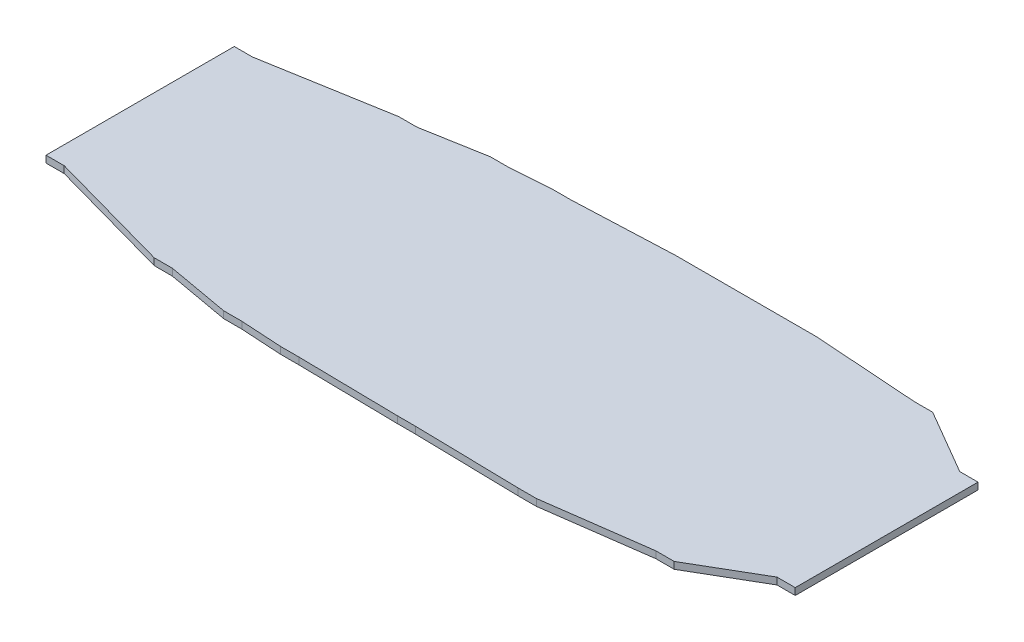
ISO-10303-21;
HEADER;
FILE_DESCRIPTION(('STEP AP214'),'2;1');
FILE_NAME('part.step','',(''),(''),'','','');
FILE_SCHEMA(('AUTOMOTIVE_DESIGN { 1 0 10303 214 1 1 1 1 }'));
ENDSEC;
DATA;
#1=APPLICATION_CONTEXT('core data for automotive mechanical design processes');
#2=APPLICATION_PROTOCOL_DEFINITION('international standard','automotive_design',2000,#1);
#3=PRODUCT_CONTEXT('',#1,'mechanical');
#4=PRODUCT('Part','Part','',(#3));
#5=PRODUCT_RELATED_PRODUCT_CATEGORY('part','',(#4));
#6=PRODUCT_DEFINITION_FORMATION('','',#4);
#7=PRODUCT_DEFINITION_CONTEXT('part definition',#1,'design');
#8=PRODUCT_DEFINITION('design','',#6,#7);
#9=PRODUCT_DEFINITION_SHAPE('','',#8);
#10=(LENGTH_UNIT() NAMED_UNIT(*) SI_UNIT(.MILLI.,.METRE.));
#11=(NAMED_UNIT(*) PLANE_ANGLE_UNIT() SI_UNIT($,.RADIAN.));
#12=(NAMED_UNIT(*) SI_UNIT($,.STERADIAN.) SOLID_ANGLE_UNIT());
#13=UNCERTAINTY_MEASURE_WITH_UNIT(LENGTH_MEASURE(1.E-05),#10,'distance_accuracy_value','');
#14=(GEOMETRIC_REPRESENTATION_CONTEXT(3) GLOBAL_UNCERTAINTY_ASSIGNED_CONTEXT((#13)) GLOBAL_UNIT_ASSIGNED_CONTEXT((#10,
#11,#12)) REPRESENTATION_CONTEXT('',''));
#15=CARTESIAN_POINT('',(0.,0.,0.));
#16=DIRECTION('',(0.,0.,1.));
#17=DIRECTION('',(1.,0.,0.));
#18=AXIS2_PLACEMENT_3D('',#15,#16,#17);
#19=CARTESIAN_POINT('',(-156.250453446982,3.,-43.9920991433387));
#20=DIRECTION('',(0.,0.,1.));
#21=DIRECTION('',(1.,0.,0.));
#22=AXIS2_PLACEMENT_3D('',#19,#20,#21);
#23=PLANE('',#22);
#24=DIRECTION('',(-1.,0.,0.));
#25=VECTOR('',#24,1.);
#26=CARTESIAN_POINT('',(-156.250453446982,0.,-43.9920991433387));
#27=LINE('',#26,#25);
#28=CARTESIAN_POINT('',(-156.250453446982,0.,-43.9920991433387));
#29=VERTEX_POINT('',#28);
#30=CARTESIAN_POINT('',(-164.250453446982,0.,-43.9920991433387));
#31=VERTEX_POINT('',#30);
#32=EDGE_CURVE('E279',#29,#31,#27,.T.);
#33=ORIENTED_EDGE('',*,*,#32,.T.);
#34=DIRECTION('',(0.,-1.,0.));
#35=VECTOR('',#34,1.);
#36=CARTESIAN_POINT('',(-164.250453446982,3.,-43.9920991433387));
#37=LINE('',#36,#35);
#38=CARTESIAN_POINT('',(-164.250453446982,3.,-43.9920991433387));
#39=VERTEX_POINT('',#38);
#40=EDGE_CURVE('E11',#39,#31,#37,.T.);
#41=ORIENTED_EDGE('',*,*,#40,.F.);
#42=DIRECTION('',(-1.,0.,0.));
#43=VECTOR('',#42,1.);
#44=CARTESIAN_POINT('',(-156.250453446982,3.,-43.9920991433387));
#45=LINE('',#44,#43);
#46=CARTESIAN_POINT('',(-156.250453446982,3.,-43.9920991433387));
#47=VERTEX_POINT('',#46);
#48=EDGE_CURVE('E341',#47,#39,#45,.T.);
#49=ORIENTED_EDGE('',*,*,#48,.F.);
#50=DIRECTION('',(0.,-1.,0.));
#51=VECTOR('',#50,1.);
#52=CARTESIAN_POINT('',(-156.250453446982,3.,-43.9920991433387));
#53=LINE('',#52,#51);
#54=EDGE_CURVE('E275',#47,#29,#53,.T.);
#55=ORIENTED_EDGE('',*,*,#54,.T.);
#56=EDGE_LOOP('',(#33,#41,#49,#55));
#57=FACE_BOUND('',#56,.T.);
#58=ADVANCED_FACE('F39',(#57),#23,.F.);
#59=CARTESIAN_POINT('',(-164.250453446982,3.,-43.9920991433387));
#60=DIRECTION('',(1.,0.,0.));
#61=DIRECTION('',(0.,0.,-1.));
#62=AXIS2_PLACEMENT_3D('',#59,#60,#61);
#63=PLANE('',#62);
#64=DIRECTION('',(0.,0.,1.));
#65=VECTOR('',#64,1.);
#66=CARTESIAN_POINT('',(-164.250453446982,0.,-43.9920991433387));
#67=LINE('',#66,#65);
#68=CARTESIAN_POINT('',(-164.250453446982,0.,38.5752174136704));
#69=VERTEX_POINT('',#68);
#70=EDGE_CURVE('E282',#31,#69,#67,.T.);
#71=ORIENTED_EDGE('',*,*,#70,.T.);
#72=DIRECTION('',(0.,-1.,0.));
#73=VECTOR('',#72,1.);
#74=CARTESIAN_POINT('',(-164.250453446982,3.,38.5752174136704));
#75=LINE('',#74,#73);
#76=CARTESIAN_POINT('',(-164.250453446982,3.,38.5752174136704));
#77=VERTEX_POINT('',#76);
#78=EDGE_CURVE('E47',#77,#69,#75,.T.);
#79=ORIENTED_EDGE('',*,*,#78,.F.);
#80=DIRECTION('',(0.,0.,1.));
#81=VECTOR('',#80,1.);
#82=CARTESIAN_POINT('',(-164.250453446982,3.,-43.9920991433387));
#83=LINE('',#82,#81);
#84=EDGE_CURVE('E170',#39,#77,#83,.T.);
#85=ORIENTED_EDGE('',*,*,#84,.F.);
#86=ORIENTED_EDGE('',*,*,#40,.T.);
#87=EDGE_LOOP('',(#71,#79,#85,#86));
#88=FACE_BOUND('',#87,.T.);
#89=ADVANCED_FACE('F519',(#88),#63,.F.);
#90=CARTESIAN_POINT('',(-164.250453446982,3.,38.5752174136704));
#91=DIRECTION('',(0.,0.,-1.));
#92=DIRECTION('',(-1.,0.,0.));
#93=AXIS2_PLACEMENT_3D('',#90,#91,#92);
#94=PLANE('',#93);
#95=DIRECTION('',(1.,0.,0.));
#96=VECTOR('',#95,1.);
#97=CARTESIAN_POINT('',(-164.250453446982,0.,38.5752174136704));
#98=LINE('',#97,#96);
#99=CARTESIAN_POINT('',(-156.250453446982,0.,38.5752174136704));
#100=VERTEX_POINT('',#99);
#101=EDGE_CURVE('E284',#69,#100,#98,.T.);
#102=ORIENTED_EDGE('',*,*,#101,.T.);
#103=DIRECTION('',(0.,-1.,0.));
#104=VECTOR('',#103,1.);
#105=CARTESIAN_POINT('',(-156.250453446982,3.,38.5752174136704));
#106=LINE('',#105,#104);
#107=CARTESIAN_POINT('',(-156.250453446982,3.,38.5752174136704));
#108=VERTEX_POINT('',#107);
#109=EDGE_CURVE('E420',#108,#100,#106,.T.);
#110=ORIENTED_EDGE('',*,*,#109,.F.);
#111=DIRECTION('',(1.,0.,0.));
#112=VECTOR('',#111,1.);
#113=CARTESIAN_POINT('',(-164.250453446982,3.,38.5752174136704));
#114=LINE('',#113,#112);
#115=EDGE_CURVE('E428',#77,#108,#114,.T.);
#116=ORIENTED_EDGE('',*,*,#115,.F.);
#117=ORIENTED_EDGE('',*,*,#78,.T.);
#118=EDGE_LOOP('',(#102,#110,#116,#117));
#119=FACE_BOUND('',#118,.T.);
#120=ADVANCED_FACE('F426',(#119),#94,.F.);
#121=CARTESIAN_POINT('',(-156.250453446982,3.,38.5752174136704));
#122=DIRECTION('',(0.268309351013595,0.,-0.963332804465136));
#123=DIRECTION('',(-0.963332804465136,0.,-0.268309351013595));
#124=AXIS2_PLACEMENT_3D('',#121,#122,#123);
#125=PLANE('',#124);
#126=DIRECTION('',(0.963332804465136,0.,0.268309351013595));
#127=VECTOR('',#126,1.);
#128=CARTESIAN_POINT('',(-156.250453446982,0.,38.5752174136704));
#129=LINE('',#128,#127);
#130=CARTESIAN_POINT('',(-101.593567098596,0.,53.7983611046002));
#131=VERTEX_POINT('',#130);
#132=EDGE_CURVE('E286',#100,#131,#129,.T.);
#133=ORIENTED_EDGE('',*,*,#132,.T.);
#134=DIRECTION('',(0.,-1.,0.));
#135=VECTOR('',#134,1.);
#136=CARTESIAN_POINT('',(-101.593567098596,3.,53.7983611046002));
#137=LINE('',#136,#135);
#138=CARTESIAN_POINT('',(-101.593567098596,3.,53.7983611046002));
#139=VERTEX_POINT('',#138);
#140=EDGE_CURVE('E417',#139,#131,#137,.T.);
#141=ORIENTED_EDGE('',*,*,#140,.F.);
#142=DIRECTION('',(0.963332804465136,0.,0.268309351013595));
#143=VECTOR('',#142,1.);
#144=CARTESIAN_POINT('',(-156.250453446982,3.,38.5752174136704));
#145=LINE('',#144,#143);
#146=EDGE_CURVE('E446',#108,#139,#145,.T.);
#147=ORIENTED_EDGE('',*,*,#146,.F.);
#148=ORIENTED_EDGE('',*,*,#109,.T.);
#149=EDGE_LOOP('',(#133,#141,#147,#148));
#150=FACE_BOUND('',#149,.T.);
#151=ADVANCED_FACE('F437',(#150),#125,.F.);
#152=CARTESIAN_POINT('',(-101.593567098596,3.,53.7983611046002));
#153=DIRECTION('',(0.,0.,-1.));
#154=DIRECTION('',(-1.,0.,0.));
#155=AXIS2_PLACEMENT_3D('',#152,#153,#154);
#156=PLANE('',#155);
#157=DIRECTION('',(1.,0.,0.));
#158=VECTOR('',#157,1.);
#159=CARTESIAN_POINT('',(-101.593567098596,0.,53.7983611046002));
#160=LINE('',#159,#158);
#161=CARTESIAN_POINT('',(-93.5935670985964,0.,53.7983611046002));
#162=VERTEX_POINT('',#161);
#163=EDGE_CURVE('E288',#131,#162,#160,.T.);
#164=ORIENTED_EDGE('',*,*,#163,.T.);
#165=DIRECTION('',(0.,-1.,0.));
#166=VECTOR('',#165,1.);
#167=CARTESIAN_POINT('',(-93.5935670985964,3.,53.7983611046002));
#168=LINE('',#167,#166);
#169=CARTESIAN_POINT('',(-93.5935670985964,3.,53.7983611046002));
#170=VERTEX_POINT('',#169);
#171=EDGE_CURVE('E414',#170,#162,#168,.T.);
#172=ORIENTED_EDGE('',*,*,#171,.F.);
#173=DIRECTION('',(1.,0.,0.));
#174=VECTOR('',#173,1.);
#175=CARTESIAN_POINT('',(-101.593567098596,3.,53.7983611046002));
#176=LINE('',#175,#174);
#177=EDGE_CURVE('E443',#139,#170,#176,.T.);
#178=ORIENTED_EDGE('',*,*,#177,.F.);
#179=ORIENTED_EDGE('',*,*,#140,.T.);
#180=EDGE_LOOP('',(#164,#172,#178,#179));
#181=FACE_BOUND('',#180,.T.);
#182=ADVANCED_FACE('F441',(#181),#156,.F.);
#183=CARTESIAN_POINT('',(-93.5935670985964,3.,53.7983611046002));
#184=DIRECTION('',(0.176143830037052,0.,-0.984364440204886));
#185=DIRECTION('',(-0.984364440204886,0.,-0.176143830037052));
#186=AXIS2_PLACEMENT_3D('',#183,#184,#185);
#187=PLANE('',#186);
#188=DIRECTION('',(0.984364440204886,0.,0.176143830037052));
#189=VECTOR('',#188,1.);
#190=CARTESIAN_POINT('',(-93.5935670985964,0.,53.7983611046002));
#191=LINE('',#190,#189);
#192=CARTESIAN_POINT('',(-66.2085244082977,0.,58.6986867443535));
#193=VERTEX_POINT('',#192);
#194=EDGE_CURVE('E290',#162,#193,#191,.T.);
#195=ORIENTED_EDGE('',*,*,#194,.T.);
#196=DIRECTION('',(0.,-1.,0.));
#197=VECTOR('',#196,1.);
#198=CARTESIAN_POINT('',(-66.2085244082977,3.,58.6986867443535));
#199=LINE('',#198,#197);
#200=CARTESIAN_POINT('',(-66.2085244082977,3.,58.6986867443535));
#201=VERTEX_POINT('',#200);
#202=EDGE_CURVE('E411',#201,#193,#199,.T.);
#203=ORIENTED_EDGE('',*,*,#202,.F.);
#204=DIRECTION('',(0.984364440204886,0.,0.176143830037052));
#205=VECTOR('',#204,1.);
#206=CARTESIAN_POINT('',(-93.5935670985964,3.,53.7983611046002));
#207=LINE('',#206,#205);
#208=EDGE_CURVE('E445',#170,#201,#207,.T.);
#209=ORIENTED_EDGE('',*,*,#208,.F.);
#210=ORIENTED_EDGE('',*,*,#171,.T.);
#211=EDGE_LOOP('',(#195,#203,#209,#210));
#212=FACE_BOUND('',#211,.T.);
#213=ADVANCED_FACE('F532',(#212),#187,.F.);
#214=CARTESIAN_POINT('',(-66.2085244082977,3.,58.6986867443535));
#215=DIRECTION('',(0.,0.,-1.));
#216=DIRECTION('',(-1.,0.,0.));
#217=AXIS2_PLACEMENT_3D('',#214,#215,#216);
#218=PLANE('',#217);
#219=DIRECTION('',(1.,0.,0.));
#220=VECTOR('',#219,1.);
#221=CARTESIAN_POINT('',(-66.2085244082977,0.,58.6986867443535));
#222=LINE('',#221,#220);
#223=CARTESIAN_POINT('',(-58.2085244082977,0.,58.6986867443535));
#224=VERTEX_POINT('',#223);
#225=EDGE_CURVE('E292',#193,#224,#222,.T.);
#226=ORIENTED_EDGE('',*,*,#225,.T.);
#227=DIRECTION('',(0.,-1.,0.));
#228=VECTOR('',#227,1.);
#229=CARTESIAN_POINT('',(-58.2085244082977,3.,58.6986867443535));
#230=LINE('',#229,#228);
#231=CARTESIAN_POINT('',(-58.2085244082977,3.,58.6986867443535));
#232=VERTEX_POINT('',#231);
#233=EDGE_CURVE('E408',#232,#224,#230,.T.);
#234=ORIENTED_EDGE('',*,*,#233,.F.);
#235=DIRECTION('',(1.,0.,0.));
#236=VECTOR('',#235,1.);
#237=CARTESIAN_POINT('',(-66.2085244082977,3.,58.6986867443535));
#238=LINE('',#237,#236);
#239=EDGE_CURVE('E448',#201,#232,#238,.T.);
#240=ORIENTED_EDGE('',*,*,#239,.F.);
#241=ORIENTED_EDGE('',*,*,#202,.T.);
#242=EDGE_LOOP('',(#226,#234,#240,#241));
#243=FACE_BOUND('',#242,.T.);
#244=ADVANCED_FACE('F535',(#243),#218,.F.);
#245=CARTESIAN_POINT('',(-58.2085244082977,3.,58.6986867443535));
#246=DIRECTION('',(0.0590441030912125,0.,-0.998255375087034));
#247=DIRECTION('',(-0.998255375087034,0.,-0.0590441030912125));
#248=AXIS2_PLACEMENT_3D('',#245,#246,#247);
#249=PLANE('',#248);
#250=DIRECTION('',(0.998255375087034,0.,0.0590441030912125));
#251=VECTOR('',#250,1.);
#252=CARTESIAN_POINT('',(-58.2085244082977,0.,58.6986867443535));
#253=LINE('',#252,#251);
#254=CARTESIAN_POINT('',(-40.1411918714085,0.,59.7673205544127));
#255=VERTEX_POINT('',#254);
#256=EDGE_CURVE('E294',#224,#255,#253,.T.);
#257=ORIENTED_EDGE('',*,*,#256,.T.);
#258=DIRECTION('',(0.,-1.,0.));
#259=VECTOR('',#258,1.);
#260=CARTESIAN_POINT('',(-40.1411918714085,3.,59.7673205544127));
#261=LINE('',#260,#259);
#262=CARTESIAN_POINT('',(-40.1411918714085,3.,59.7673205544127));
#263=VERTEX_POINT('',#262);
#264=EDGE_CURVE('E405',#263,#255,#261,.T.);
#265=ORIENTED_EDGE('',*,*,#264,.F.);
#266=DIRECTION('',(0.998255375087034,0.,0.0590441030912125));
#267=VECTOR('',#266,1.);
#268=CARTESIAN_POINT('',(-58.2085244082977,3.,58.6986867443535));
#269=LINE('',#268,#267);
#270=EDGE_CURVE('E454',#232,#263,#269,.T.);
#271=ORIENTED_EDGE('',*,*,#270,.F.);
#272=ORIENTED_EDGE('',*,*,#233,.T.);
#273=EDGE_LOOP('',(#257,#265,#271,#272));
#274=FACE_BOUND('',#273,.T.);
#275=ADVANCED_FACE('F539',(#274),#249,.F.);
#276=CARTESIAN_POINT('',(-40.1411918714085,3.,59.7673205544127));
#277=DIRECTION('',(0.,0.,-1.));
#278=DIRECTION('',(-1.,0.,0.));
#279=AXIS2_PLACEMENT_3D('',#276,#277,#278);
#280=PLANE('',#279);
#281=DIRECTION('',(1.,0.,0.));
#282=VECTOR('',#281,1.);
#283=CARTESIAN_POINT('',(-40.1411918714085,0.,59.7673205544127));
#284=LINE('',#283,#282);
#285=CARTESIAN_POINT('',(-32.1411918714085,0.,59.7673205544127));
#286=VERTEX_POINT('',#285);
#287=EDGE_CURVE('E296',#255,#286,#284,.T.);
#288=ORIENTED_EDGE('',*,*,#287,.T.);
#289=DIRECTION('',(0.,-1.,0.));
#290=VECTOR('',#289,1.);
#291=CARTESIAN_POINT('',(-32.1411918714085,3.,59.7673205544127));
#292=LINE('',#291,#290);
#293=CARTESIAN_POINT('',(-32.1411918714085,3.,59.7673205544127));
#294=VERTEX_POINT('',#293);
#295=EDGE_CURVE('E402',#294,#286,#292,.T.);
#296=ORIENTED_EDGE('',*,*,#295,.F.);
#297=DIRECTION('',(1.,0.,0.));
#298=VECTOR('',#297,1.);
#299=CARTESIAN_POINT('',(-40.1411918714085,3.,59.7673205544127));
#300=LINE('',#299,#298);
#301=EDGE_CURVE('E456',#263,#294,#300,.T.);
#302=ORIENTED_EDGE('',*,*,#301,.F.);
#303=ORIENTED_EDGE('',*,*,#264,.T.);
#304=EDGE_LOOP('',(#288,#296,#302,#303));
#305=FACE_BOUND('',#304,.T.);
#306=ADVANCED_FACE('F543',(#305),#280,.F.);
#307=CARTESIAN_POINT('',(-32.1411918714085,3.,59.7673205544127));
#308=DIRECTION('',(0.0163194432265968,0.,-0.999866829019132));
#309=DIRECTION('',(-0.999866829019132,0.,-0.0163194432265968));
#310=AXIS2_PLACEMENT_3D('',#307,#308,#309);
#311=PLANE('',#310);
#312=DIRECTION('',(0.999866829019132,0.,0.0163194432265968));
#313=VECTOR('',#312,1.);
#314=CARTESIAN_POINT('',(-32.1411918714085,0.,59.7673205544127));
#315=LINE('',#314,#313);
#316=CARTESIAN_POINT('',(11.7329385787983,0.,60.483417298717));
#317=VERTEX_POINT('',#316);
#318=EDGE_CURVE('E298',#286,#317,#315,.T.);
#319=ORIENTED_EDGE('',*,*,#318,.T.);
#320=DIRECTION('',(0.,-1.,0.));
#321=VECTOR('',#320,1.);
#322=CARTESIAN_POINT('',(11.7329385787983,3.,60.483417298717));
#323=LINE('',#322,#321);
#324=CARTESIAN_POINT('',(11.7329385787983,3.,60.483417298717));
#325=VERTEX_POINT('',#324);
#326=EDGE_CURVE('E399',#325,#317,#323,.T.);
#327=ORIENTED_EDGE('',*,*,#326,.F.);
#328=DIRECTION('',(0.999866829019132,0.,0.0163194432265968));
#329=VECTOR('',#328,1.);
#330=CARTESIAN_POINT('',(-32.1411918714085,3.,59.7673205544127));
#331=LINE('',#330,#329);
#332=EDGE_CURVE('E458',#294,#325,#331,.T.);
#333=ORIENTED_EDGE('',*,*,#332,.F.);
#334=ORIENTED_EDGE('',*,*,#295,.T.);
#335=EDGE_LOOP('',(#319,#327,#333,#334));
#336=FACE_BOUND('',#335,.T.);
#337=ADVANCED_FACE('F547',(#336),#311,.F.);
#338=CARTESIAN_POINT('',(11.7329385787983,3.,60.483417298717));
#339=DIRECTION('',(0.,0.,-1.));
#340=DIRECTION('',(-1.,0.,0.));
#341=AXIS2_PLACEMENT_3D('',#338,#339,#340);
#342=PLANE('',#341);
#343=DIRECTION('',(1.,0.,0.));
#344=VECTOR('',#343,1.);
#345=CARTESIAN_POINT('',(11.7329385787983,0.,60.483417298717));
#346=LINE('',#345,#344);
#347=CARTESIAN_POINT('',(19.7329385787983,0.,60.483417298717));
#348=VERTEX_POINT('',#347);
#349=EDGE_CURVE('E300',#317,#348,#346,.T.);
#350=ORIENTED_EDGE('',*,*,#349,.T.);
#351=DIRECTION('',(0.,-1.,0.));
#352=VECTOR('',#351,1.);
#353=CARTESIAN_POINT('',(19.7329385787983,3.,60.483417298717));
#354=LINE('',#353,#352);
#355=CARTESIAN_POINT('',(19.7329385787983,3.,60.483417298717));
#356=VERTEX_POINT('',#355);
#357=EDGE_CURVE('E396',#356,#348,#354,.T.);
#358=ORIENTED_EDGE('',*,*,#357,.F.);
#359=DIRECTION('',(1.,0.,0.));
#360=VECTOR('',#359,1.);
#361=CARTESIAN_POINT('',(11.7329385787983,3.,60.483417298717));
#362=LINE('',#361,#360);
#363=EDGE_CURVE('E460',#325,#356,#362,.T.);
#364=ORIENTED_EDGE('',*,*,#363,.F.);
#365=ORIENTED_EDGE('',*,*,#326,.T.);
#366=EDGE_LOOP('',(#350,#358,#364,#365));
#367=FACE_BOUND('',#366,.T.);
#368=ADVANCED_FACE('F551',(#367),#342,.F.);
#369=CARTESIAN_POINT('',(19.7329385787983,3.,60.483417298717));
#370=DIRECTION('',(0.020677509614742,0.,-0.999786197442299));
#371=DIRECTION('',(-0.999786197442299,0.,-0.020677509614742));
#372=AXIS2_PLACEMENT_3D('',#369,#370,#371);
#373=PLANE('',#372);
#374=DIRECTION('',(0.999786197442299,0.,0.020677509614742));
#375=VECTOR('',#374,1.);
#376=CARTESIAN_POINT('',(19.7329385787983,0.,60.483417298717));
#377=LINE('',#376,#375);
#378=CARTESIAN_POINT('',(65.6346614758115,0.,61.4327535857795));
#379=VERTEX_POINT('',#378);
#380=EDGE_CURVE('E302',#348,#379,#377,.T.);
#381=ORIENTED_EDGE('',*,*,#380,.T.);
#382=DIRECTION('',(0.,-1.,0.));
#383=VECTOR('',#382,1.);
#384=CARTESIAN_POINT('',(65.6346614758115,3.,61.4327535857795));
#385=LINE('',#384,#383);
#386=CARTESIAN_POINT('',(65.6346614758115,3.,61.4327535857795));
#387=VERTEX_POINT('',#386);
#388=EDGE_CURVE('E393',#387,#379,#385,.T.);
#389=ORIENTED_EDGE('',*,*,#388,.F.);
#390=DIRECTION('',(0.999786197442299,0.,0.020677509614742));
#391=VECTOR('',#390,1.);
#392=CARTESIAN_POINT('',(19.7329385787983,3.,60.483417298717));
#393=LINE('',#392,#391);
#394=EDGE_CURVE('E462',#356,#387,#393,.T.);
#395=ORIENTED_EDGE('',*,*,#394,.F.);
#396=ORIENTED_EDGE('',*,*,#357,.T.);
#397=EDGE_LOOP('',(#381,#389,#395,#396));
#398=FACE_BOUND('',#397,.T.);
#399=ADVANCED_FACE('F555',(#398),#373,.F.);
#400=CARTESIAN_POINT('',(65.6346614758115,3.,61.4327535857795));
#401=DIRECTION('',(0.,0.,-1.));
#402=DIRECTION('',(-1.,0.,0.));
#403=AXIS2_PLACEMENT_3D('',#400,#401,#402);
#404=PLANE('',#403);
#405=DIRECTION('',(1.,0.,0.));
#406=VECTOR('',#405,1.);
#407=CARTESIAN_POINT('',(65.6346614758115,0.,61.4327535857795));
#408=LINE('',#407,#406);
#409=CARTESIAN_POINT('',(73.6346614758115,0.,61.4327535857795));
#410=VERTEX_POINT('',#409);
#411=EDGE_CURVE('E304',#379,#410,#408,.T.);
#412=ORIENTED_EDGE('',*,*,#411,.T.);
#413=DIRECTION('',(0.,-1.,0.));
#414=VECTOR('',#413,1.);
#415=CARTESIAN_POINT('',(73.6346614758115,3.,61.4327535857795));
#416=LINE('',#415,#414);
#417=CARTESIAN_POINT('',(73.6346614758115,3.,61.4327535857795));
#418=VERTEX_POINT('',#417);
#419=EDGE_CURVE('E390',#418,#410,#416,.T.);
#420=ORIENTED_EDGE('',*,*,#419,.F.);
#421=DIRECTION('',(1.,0.,0.));
#422=VECTOR('',#421,1.);
#423=CARTESIAN_POINT('',(65.6346614758115,3.,61.4327535857795));
#424=LINE('',#423,#422);
#425=EDGE_CURVE('E464',#387,#418,#424,.T.);
#426=ORIENTED_EDGE('',*,*,#425,.F.);
#427=ORIENTED_EDGE('',*,*,#388,.T.);
#428=EDGE_LOOP('',(#412,#420,#426,#427));
#429=FACE_BOUND('',#428,.T.);
#430=ADVANCED_FACE('F559',(#429),#404,.F.);
#431=CARTESIAN_POINT('',(73.6346614758115,3.,61.4327535857795));
#432=DIRECTION('',(-0.135862120546839,0.,-0.990727754835058));
#433=DIRECTION('',(-0.990727754835059,0.,0.135862120546839));
#434=AXIS2_PLACEMENT_3D('',#431,#432,#433);
#435=PLANE('',#434);
#436=DIRECTION('',(0.990727754835059,0.,-0.135862120546839));
#437=VECTOR('',#436,1.);
#438=CARTESIAN_POINT('',(73.6346614758115,0.,61.4327535857795));
#439=LINE('',#438,#437);
#440=CARTESIAN_POINT('',(119.770630772954,0.,55.1059593765699));
#441=VERTEX_POINT('',#440);
#442=EDGE_CURVE('E306',#410,#441,#439,.T.);
#443=ORIENTED_EDGE('',*,*,#442,.T.);
#444=DIRECTION('',(0.,-1.,0.));
#445=VECTOR('',#444,1.);
#446=CARTESIAN_POINT('',(119.770630772954,3.,55.1059593765699));
#447=LINE('',#446,#445);
#448=CARTESIAN_POINT('',(119.770630772954,3.,55.1059593765699));
#449=VERTEX_POINT('',#448);
#450=EDGE_CURVE('E387',#449,#441,#447,.T.);
#451=ORIENTED_EDGE('',*,*,#450,.F.);
#452=DIRECTION('',(0.990727754835059,0.,-0.135862120546839));
#453=VECTOR('',#452,1.);
#454=CARTESIAN_POINT('',(73.6346614758115,3.,61.4327535857795));
#455=LINE('',#454,#453);
#456=EDGE_CURVE('E466',#418,#449,#455,.T.);
#457=ORIENTED_EDGE('',*,*,#456,.F.);
#458=ORIENTED_EDGE('',*,*,#419,.T.);
#459=EDGE_LOOP('',(#443,#451,#457,#458));
#460=FACE_BOUND('',#459,.T.);
#461=ADVANCED_FACE('F563',(#460),#435,.F.);
#462=CARTESIAN_POINT('',(119.770630772954,3.,55.1059593765699));
#463=DIRECTION('',(0.,0.,-1.));
#464=DIRECTION('',(-1.,0.,0.));
#465=AXIS2_PLACEMENT_3D('',#462,#463,#464);
#466=PLANE('',#465);
#467=DIRECTION('',(1.,0.,0.));
#468=VECTOR('',#467,1.);
#469=CARTESIAN_POINT('',(119.770630772954,0.,55.1059593765699));
#470=LINE('',#469,#468);
#471=CARTESIAN_POINT('',(127.770630772954,0.,55.1059593765699));
#472=VERTEX_POINT('',#471);
#473=EDGE_CURVE('E308',#441,#472,#470,.T.);
#474=ORIENTED_EDGE('',*,*,#473,.T.);
#475=DIRECTION('',(0.,-1.,0.));
#476=VECTOR('',#475,1.);
#477=CARTESIAN_POINT('',(127.770630772954,3.,55.1059593765699));
#478=LINE('',#477,#476);
#479=CARTESIAN_POINT('',(127.770630772954,3.,55.1059593765699));
#480=VERTEX_POINT('',#479);
#481=EDGE_CURVE('E384',#480,#472,#478,.T.);
#482=ORIENTED_EDGE('',*,*,#481,.F.);
#483=DIRECTION('',(1.,0.,0.));
#484=VECTOR('',#483,1.);
#485=CARTESIAN_POINT('',(119.770630772954,3.,55.1059593765699));
#486=LINE('',#485,#484);
#487=EDGE_CURVE('E468',#449,#480,#486,.T.);
#488=ORIENTED_EDGE('',*,*,#487,.F.);
#489=ORIENTED_EDGE('',*,*,#450,.T.);
#490=EDGE_LOOP('',(#474,#482,#488,#489));
#491=FACE_BOUND('',#490,.T.);
#492=ADVANCED_FACE('F567',(#491),#466,.F.);
#493=CARTESIAN_POINT('',(127.770630772954,3.,55.1059593765699));
#494=DIRECTION('',(-0.50314556414795,0.,-0.86420167859027));
#495=DIRECTION('',(-0.864201678590271,0.,0.50314556414795));
#496=AXIS2_PLACEMENT_3D('',#493,#494,#495);
#497=PLANE('',#496);
#498=DIRECTION('',(0.864201678590271,0.,-0.50314556414795));
#499=VECTOR('',#498,1.);
#500=CARTESIAN_POINT('',(127.770630772954,0.,55.1059593765699));
#501=LINE('',#500,#499);
#502=CARTESIAN_POINT('',(156.250453446982,0.,38.524764499082));
#503=VERTEX_POINT('',#502);
#504=EDGE_CURVE('E310',#472,#503,#501,.T.);
#505=ORIENTED_EDGE('',*,*,#504,.T.);
#506=DIRECTION('',(0.,-1.,0.));
#507=VECTOR('',#506,1.);
#508=CARTESIAN_POINT('',(156.250453446982,3.,38.524764499082));
#509=LINE('',#508,#507);
#510=CARTESIAN_POINT('',(156.250453446982,3.,38.524764499082));
#511=VERTEX_POINT('',#510);
#512=EDGE_CURVE('E381',#511,#503,#509,.T.);
#513=ORIENTED_EDGE('',*,*,#512,.F.);
#514=DIRECTION('',(0.864201678590271,0.,-0.50314556414795));
#515=VECTOR('',#514,1.);
#516=CARTESIAN_POINT('',(127.770630772954,3.,55.1059593765699));
#517=LINE('',#516,#515);
#518=EDGE_CURVE('E470',#480,#511,#517,.T.);
#519=ORIENTED_EDGE('',*,*,#518,.F.);
#520=ORIENTED_EDGE('',*,*,#481,.T.);
#521=EDGE_LOOP('',(#505,#513,#519,#520));
#522=FACE_BOUND('',#521,.T.);
#523=ADVANCED_FACE('F571',(#522),#497,.F.);
#524=CARTESIAN_POINT('',(156.250453446982,3.,38.524764499082));
#525=DIRECTION('',(0.,0.,-1.));
#526=DIRECTION('',(-1.,0.,0.));
#527=AXIS2_PLACEMENT_3D('',#524,#525,#526);
#528=PLANE('',#527);
#529=DIRECTION('',(1.,0.,0.));
#530=VECTOR('',#529,1.);
#531=CARTESIAN_POINT('',(156.250453446982,0.,38.524764499082));
#532=LINE('',#531,#530);
#533=CARTESIAN_POINT('',(164.250453446982,0.,38.524764499082));
#534=VERTEX_POINT('',#533);
#535=EDGE_CURVE('E312',#503,#534,#532,.T.);
#536=ORIENTED_EDGE('',*,*,#535,.T.);
#537=DIRECTION('',(0.,-1.,0.));
#538=VECTOR('',#537,1.);
#539=CARTESIAN_POINT('',(164.250453446982,3.,38.524764499082));
#540=LINE('',#539,#538);
#541=CARTESIAN_POINT('',(164.250453446982,3.,38.524764499082));
#542=VERTEX_POINT('',#541);
#543=EDGE_CURVE('E378',#542,#534,#540,.T.);
#544=ORIENTED_EDGE('',*,*,#543,.F.);
#545=DIRECTION('',(1.,0.,0.));
#546=VECTOR('',#545,1.);
#547=CARTESIAN_POINT('',(156.250453446982,3.,38.524764499082));
#548=LINE('',#547,#546);
#549=EDGE_CURVE('E472',#511,#542,#548,.T.);
#550=ORIENTED_EDGE('',*,*,#549,.F.);
#551=ORIENTED_EDGE('',*,*,#512,.T.);
#552=EDGE_LOOP('',(#536,#544,#550,#551));
#553=FACE_BOUND('',#552,.T.);
#554=ADVANCED_FACE('F575',(#553),#528,.F.);
#555=CARTESIAN_POINT('',(164.250453446982,3.,38.524764499082));
#556=DIRECTION('',(-1.,0.,0.));
#557=DIRECTION('',(0.,0.,1.));
#558=AXIS2_PLACEMENT_3D('',#555,#556,#557);
#559=PLANE('',#558);
#560=DIRECTION('',(0.,0.,-1.));
#561=VECTOR('',#560,1.);
#562=CARTESIAN_POINT('',(164.250453446982,0.,38.524764499082));
#563=LINE('',#562,#561);
#564=CARTESIAN_POINT('',(164.250453446982,0.,-41.6216225647743));
#565=VERTEX_POINT('',#564);
#566=EDGE_CURVE('E314',#534,#565,#563,.T.);
#567=ORIENTED_EDGE('',*,*,#566,.T.);
#568=DIRECTION('',(0.,-1.,0.));
#569=VECTOR('',#568,1.);
#570=CARTESIAN_POINT('',(164.250453446982,3.,-41.6216225647743));
#571=LINE('',#570,#569);
#572=CARTESIAN_POINT('',(164.250453446982,3.,-41.6216225647743));
#573=VERTEX_POINT('',#572);
#574=EDGE_CURVE('E375',#573,#565,#571,.T.);
#575=ORIENTED_EDGE('',*,*,#574,.F.);
#576=DIRECTION('',(0.,0.,-1.));
#577=VECTOR('',#576,1.);
#578=CARTESIAN_POINT('',(164.250453446982,3.,38.524764499082));
#579=LINE('',#578,#577);
#580=EDGE_CURVE('E474',#542,#573,#579,.T.);
#581=ORIENTED_EDGE('',*,*,#580,.F.);
#582=ORIENTED_EDGE('',*,*,#543,.T.);
#583=EDGE_LOOP('',(#567,#575,#581,#582));
#584=FACE_BOUND('',#583,.T.);
#585=ADVANCED_FACE('F579',(#584),#559,.F.);
#586=CARTESIAN_POINT('',(164.250453446982,3.,-41.6216225647743));
#587=DIRECTION('',(0.,0.,1.));
#588=DIRECTION('',(1.,0.,0.));
#589=AXIS2_PLACEMENT_3D('',#586,#587,#588);
#590=PLANE('',#589);
#591=DIRECTION('',(-1.,0.,0.));
#592=VECTOR('',#591,1.);
#593=CARTESIAN_POINT('',(164.250453446982,0.,-41.6216225647743));
#594=LINE('',#593,#592);
#595=CARTESIAN_POINT('',(156.250453446982,0.,-41.6216225647743));
#596=VERTEX_POINT('',#595);
#597=EDGE_CURVE('E316',#565,#596,#594,.T.);
#598=ORIENTED_EDGE('',*,*,#597,.T.);
#599=DIRECTION('',(0.,-1.,0.));
#600=VECTOR('',#599,1.);
#601=CARTESIAN_POINT('',(156.250453446982,3.,-41.6216225647743));
#602=LINE('',#601,#600);
#603=CARTESIAN_POINT('',(156.250453446982,3.,-41.6216225647743));
#604=VERTEX_POINT('',#603);
#605=EDGE_CURVE('E372',#604,#596,#602,.T.);
#606=ORIENTED_EDGE('',*,*,#605,.F.);
#607=DIRECTION('',(-1.,0.,0.));
#608=VECTOR('',#607,1.);
#609=CARTESIAN_POINT('',(164.250453446982,3.,-41.6216225647743));
#610=LINE('',#609,#608);
#611=EDGE_CURVE('E476',#573,#604,#610,.T.);
#612=ORIENTED_EDGE('',*,*,#611,.F.);
#613=ORIENTED_EDGE('',*,*,#574,.T.);
#614=EDGE_LOOP('',(#598,#606,#612,#613));
#615=FACE_BOUND('',#614,.T.);
#616=ADVANCED_FACE('F583',(#615),#590,.F.);
#617=CARTESIAN_POINT('',(156.250453446982,3.,-41.6216225647743));
#618=DIRECTION('',(-0.503631780420991,0.,0.863918416142394));
#619=DIRECTION('',(0.863918416142394,0.,0.503631780420991));
#620=AXIS2_PLACEMENT_3D('',#617,#618,#619);
#621=PLANE('',#620);
#622=DIRECTION('',(-0.863918416142394,0.,-0.503631780420991));
#623=VECTOR('',#622,1.);
#624=CARTESIAN_POINT('',(156.250453446982,0.,-41.6216225647743));
#625=LINE('',#624,#623);
#626=CARTESIAN_POINT('',(127.770630772954,0.,-58.2242826439996));
#627=VERTEX_POINT('',#626);
#628=EDGE_CURVE('E318',#596,#627,#625,.T.);
#629=ORIENTED_EDGE('',*,*,#628,.T.);
#630=DIRECTION('',(0.,-1.,0.));
#631=VECTOR('',#630,1.);
#632=CARTESIAN_POINT('',(127.770630772954,3.,-58.2242826439996));
#633=LINE('',#632,#631);
#634=CARTESIAN_POINT('',(127.770630772954,3.,-58.2242826439996));
#635=VERTEX_POINT('',#634);
#636=EDGE_CURVE('E369',#635,#627,#633,.T.);
#637=ORIENTED_EDGE('',*,*,#636,.F.);
#638=DIRECTION('',(-0.863918416142394,0.,-0.503631780420991));
#639=VECTOR('',#638,1.);
#640=CARTESIAN_POINT('',(156.250453446982,3.,-41.6216225647743));
#641=LINE('',#640,#639);
#642=EDGE_CURVE('E478',#604,#635,#641,.T.);
#643=ORIENTED_EDGE('',*,*,#642,.F.);
#644=ORIENTED_EDGE('',*,*,#605,.T.);
#645=EDGE_LOOP('',(#629,#637,#643,#644));
#646=FACE_BOUND('',#645,.T.);
#647=ADVANCED_FACE('F587',(#646),#621,.F.);
#648=CARTESIAN_POINT('',(127.770630772954,3.,-58.2242826439996));
#649=DIRECTION('',(0.,0.,1.));
#650=DIRECTION('',(1.,0.,0.));
#651=AXIS2_PLACEMENT_3D('',#648,#649,#650);
#652=PLANE('',#651);
#653=DIRECTION('',(-1.,0.,0.));
#654=VECTOR('',#653,1.);
#655=CARTESIAN_POINT('',(127.770630772954,0.,-58.2242826439996));
#656=LINE('',#655,#654);
#657=CARTESIAN_POINT('',(119.770630772954,0.,-58.2242826439996));
#658=VERTEX_POINT('',#657);
#659=EDGE_CURVE('E320',#627,#658,#656,.T.);
#660=ORIENTED_EDGE('',*,*,#659,.T.);
#661=DIRECTION('',(0.,-1.,0.));
#662=VECTOR('',#661,1.);
#663=CARTESIAN_POINT('',(119.770630772954,3.,-58.2242826439996));
#664=LINE('',#663,#662);
#665=CARTESIAN_POINT('',(119.770630772954,3.,-58.2242826439996));
#666=VERTEX_POINT('',#665);
#667=EDGE_CURVE('E366',#666,#658,#664,.T.);
#668=ORIENTED_EDGE('',*,*,#667,.F.);
#669=DIRECTION('',(-1.,0.,0.));
#670=VECTOR('',#669,1.);
#671=CARTESIAN_POINT('',(127.770630772954,3.,-58.2242826439996));
#672=LINE('',#671,#670);
#673=EDGE_CURVE('E480',#635,#666,#672,.T.);
#674=ORIENTED_EDGE('',*,*,#673,.F.);
#675=ORIENTED_EDGE('',*,*,#636,.T.);
#676=EDGE_LOOP('',(#660,#668,#674,#675));
#677=FACE_BOUND('',#676,.T.);
#678=ADVANCED_FACE('F591',(#677),#652,.F.);
#679=CARTESIAN_POINT('',(119.770630772954,3.,-58.2242826439996));
#680=DIRECTION('',(-0.0693762456975866,0.,0.99759056557934));
#681=DIRECTION('',(0.99759056557934,0.,0.0693762456975866));
#682=AXIS2_PLACEMENT_3D('',#679,#680,#681);
#683=PLANE('',#682);
#684=DIRECTION('',(-0.99759056557934,0.,-0.0693762456975866));
#685=VECTOR('',#684,1.);
#686=CARTESIAN_POINT('',(119.770630772954,0.,-58.2242826439996));
#687=LINE('',#686,#685);
#688=CARTESIAN_POINT('',(73.6346614758115,0.,-61.4327535857793));
#689=VERTEX_POINT('',#688);
#690=EDGE_CURVE('E322',#658,#689,#687,.T.);
#691=ORIENTED_EDGE('',*,*,#690,.T.);
#692=DIRECTION('',(0.,-1.,0.));
#693=VECTOR('',#692,1.);
#694=CARTESIAN_POINT('',(73.6346614758115,3.,-61.4327535857793));
#695=LINE('',#694,#693);
#696=CARTESIAN_POINT('',(73.6346614758115,3.,-61.4327535857793));
#697=VERTEX_POINT('',#696);
#698=EDGE_CURVE('E363',#697,#689,#695,.T.);
#699=ORIENTED_EDGE('',*,*,#698,.F.);
#700=DIRECTION('',(-0.99759056557934,0.,-0.0693762456975866));
#701=VECTOR('',#700,1.);
#702=CARTESIAN_POINT('',(119.770630772954,3.,-58.2242826439996));
#703=LINE('',#702,#701);
#704=EDGE_CURVE('E482',#666,#697,#703,.T.);
#705=ORIENTED_EDGE('',*,*,#704,.F.);
#706=ORIENTED_EDGE('',*,*,#667,.T.);
#707=EDGE_LOOP('',(#691,#699,#705,#706));
#708=FACE_BOUND('',#707,.T.);
#709=ADVANCED_FACE('F595',(#708),#683,.F.);
#710=CARTESIAN_POINT('',(73.6346614758115,3.,-61.4327535857793));
#711=DIRECTION('',(0.,0.,1.));
#712=DIRECTION('',(1.,0.,0.));
#713=AXIS2_PLACEMENT_3D('',#710,#711,#712);
#714=PLANE('',#713);
#715=DIRECTION('',(-1.,0.,0.));
#716=VECTOR('',#715,1.);
#717=CARTESIAN_POINT('',(73.6346614758115,0.,-61.4327535857793));
#718=LINE('',#717,#716);
#719=CARTESIAN_POINT('',(65.6346614758115,0.,-61.4327535857793));
#720=VERTEX_POINT('',#719);
#721=EDGE_CURVE('E324',#689,#720,#718,.T.);
#722=ORIENTED_EDGE('',*,*,#721,.T.);
#723=DIRECTION('',(0.,-1.,0.));
#724=VECTOR('',#723,1.);
#725=CARTESIAN_POINT('',(65.6346614758115,3.,-61.4327535857793));
#726=LINE('',#725,#724);
#727=CARTESIAN_POINT('',(65.6346614758115,3.,-61.4327535857793));
#728=VERTEX_POINT('',#727);
#729=EDGE_CURVE('E360',#728,#720,#726,.T.);
#730=ORIENTED_EDGE('',*,*,#729,.F.);
#731=DIRECTION('',(-1.,0.,0.));
#732=VECTOR('',#731,1.);
#733=CARTESIAN_POINT('',(73.6346614758115,3.,-61.4327535857793));
#734=LINE('',#733,#732);
#735=EDGE_CURVE('E484',#697,#728,#734,.T.);
#736=ORIENTED_EDGE('',*,*,#735,.F.);
#737=ORIENTED_EDGE('',*,*,#698,.T.);
#738=EDGE_LOOP('',(#722,#730,#736,#737));
#739=FACE_BOUND('',#738,.T.);
#740=ADVANCED_FACE('F599',(#739),#714,.F.);
#741=CARTESIAN_POINT('',(65.6346614758115,3.,-61.4327535857793));
#742=DIRECTION('',(0.000507806760269869,0.,0.999999871066139));
#743=DIRECTION('',(0.999999871066139,0.,-0.000507806760269869));
#744=AXIS2_PLACEMENT_3D('',#741,#742,#743);
#745=PLANE('',#744);
#746=DIRECTION('',(-0.999999871066139,0.,0.000507806760269869));
#747=VECTOR('',#746,1.);
#748=CARTESIAN_POINT('',(65.6346614758115,0.,-61.4327535857793));
#749=LINE('',#748,#747);
#750=CARTESIAN_POINT('',(19.7329385787983,0.,-61.4094443775788));
#751=VERTEX_POINT('',#750);
#752=EDGE_CURVE('E326',#720,#751,#749,.T.);
#753=ORIENTED_EDGE('',*,*,#752,.T.);
#754=DIRECTION('',(0.,-1.,0.));
#755=VECTOR('',#754,1.);
#756=CARTESIAN_POINT('',(19.7329385787983,3.,-61.4094443775788));
#757=LINE('',#756,#755);
#758=CARTESIAN_POINT('',(19.7329385787983,3.,-61.4094443775788));
#759=VERTEX_POINT('',#758);
#760=EDGE_CURVE('E357',#759,#751,#757,.T.);
#761=ORIENTED_EDGE('',*,*,#760,.F.);
#762=DIRECTION('',(-0.999999871066139,0.,0.000507806760269869));
#763=VECTOR('',#762,1.);
#764=CARTESIAN_POINT('',(65.6346614758115,3.,-61.4327535857793));
#765=LINE('',#764,#763);
#766=EDGE_CURVE('E486',#728,#759,#765,.T.);
#767=ORIENTED_EDGE('',*,*,#766,.F.);
#768=ORIENTED_EDGE('',*,*,#729,.T.);
#769=EDGE_LOOP('',(#753,#761,#767,#768));
#770=FACE_BOUND('',#769,.T.);
#771=ADVANCED_FACE('F603',(#770),#745,.F.);
#772=CARTESIAN_POINT('',(19.7329385787983,3.,-61.4094443775788));
#773=DIRECTION('',(0.,0.,1.));
#774=DIRECTION('',(1.,0.,0.));
#775=AXIS2_PLACEMENT_3D('',#772,#773,#774);
#776=PLANE('',#775);
#777=DIRECTION('',(-1.,0.,0.));
#778=VECTOR('',#777,1.);
#779=CARTESIAN_POINT('',(19.7329385787983,0.,-61.4094443775788));
#780=LINE('',#779,#778);
#781=CARTESIAN_POINT('',(11.7329385787983,0.,-61.4094443775788));
#782=VERTEX_POINT('',#781);
#783=EDGE_CURVE('E328',#751,#782,#780,.T.);
#784=ORIENTED_EDGE('',*,*,#783,.T.);
#785=DIRECTION('',(0.,-1.,0.));
#786=VECTOR('',#785,1.);
#787=CARTESIAN_POINT('',(11.7329385787983,3.,-61.4094443775788));
#788=LINE('',#787,#786);
#789=CARTESIAN_POINT('',(11.7329385787983,3.,-61.4094443775788));
#790=VERTEX_POINT('',#789);
#791=EDGE_CURVE('E354',#790,#782,#788,.T.);
#792=ORIENTED_EDGE('',*,*,#791,.F.);
#793=DIRECTION('',(-1.,0.,0.));
#794=VECTOR('',#793,1.);
#795=CARTESIAN_POINT('',(19.7329385787983,3.,-61.4094443775788));
#796=LINE('',#795,#794);
#797=EDGE_CURVE('E488',#759,#790,#796,.T.);
#798=ORIENTED_EDGE('',*,*,#797,.F.);
#799=ORIENTED_EDGE('',*,*,#760,.T.);
#800=EDGE_LOOP('',(#784,#792,#798,#799));
#801=FACE_BOUND('',#800,.T.);
#802=ADVANCED_FACE('F607',(#801),#776,.F.);
#803=CARTESIAN_POINT('',(11.7329385787983,3.,-61.4094443775788));
#804=DIRECTION('',(0.0424692638958947,0.,0.999097773806018));
#805=DIRECTION('',(0.999097773806018,0.,-0.0424692638958947));
#806=AXIS2_PLACEMENT_3D('',#803,#804,#805);
#807=PLANE('',#806);
#808=DIRECTION('',(-0.999097773806018,0.,0.0424692638958947));
#809=VECTOR('',#808,1.);
#810=CARTESIAN_POINT('',(11.7329385787983,0.,-61.4094443775788));
#811=LINE('',#810,#809);
#812=CARTESIAN_POINT('',(-32.1411918714085,0.,-59.5444597152723));
#813=VERTEX_POINT('',#812);
#814=EDGE_CURVE('E330',#782,#813,#811,.T.);
#815=ORIENTED_EDGE('',*,*,#814,.T.);
#816=DIRECTION('',(0.,-1.,0.));
#817=VECTOR('',#816,1.);
#818=CARTESIAN_POINT('',(-32.1411918714085,3.,-59.5444597152723));
#819=LINE('',#818,#817);
#820=CARTESIAN_POINT('',(-32.1411918714085,3.,-59.5444597152723));
#821=VERTEX_POINT('',#820);
#822=EDGE_CURVE('E351',#821,#813,#819,.T.);
#823=ORIENTED_EDGE('',*,*,#822,.F.);
#824=DIRECTION('',(-0.999097773806018,0.,0.0424692638958947));
#825=VECTOR('',#824,1.);
#826=CARTESIAN_POINT('',(11.7329385787983,3.,-61.4094443775788));
#827=LINE('',#826,#825);
#828=EDGE_CURVE('E490',#790,#821,#827,.T.);
#829=ORIENTED_EDGE('',*,*,#828,.F.);
#830=ORIENTED_EDGE('',*,*,#791,.T.);
#831=EDGE_LOOP('',(#815,#823,#829,#830));
#832=FACE_BOUND('',#831,.T.);
#833=ADVANCED_FACE('F611',(#832),#807,.F.);
#834=CARTESIAN_POINT('',(-32.1411918714085,3.,-59.5444597152723));
#835=DIRECTION('',(0.,0.,1.));
#836=DIRECTION('',(1.,0.,0.));
#837=AXIS2_PLACEMENT_3D('',#834,#835,#836);
#838=PLANE('',#837);
#839=DIRECTION('',(-1.,0.,0.));
#840=VECTOR('',#839,1.);
#841=CARTESIAN_POINT('',(-32.1411918714085,0.,-59.5444597152723));
#842=LINE('',#841,#840);
#843=CARTESIAN_POINT('',(-40.1411918714085,0.,-59.5444597152723));
#844=VERTEX_POINT('',#843);
#845=EDGE_CURVE('E332',#813,#844,#842,.T.);
#846=ORIENTED_EDGE('',*,*,#845,.T.);
#847=DIRECTION('',(0.,-1.,0.));
#848=VECTOR('',#847,1.);
#849=CARTESIAN_POINT('',(-40.1411918714085,3.,-59.5444597152723));
#850=LINE('',#849,#848);
#851=CARTESIAN_POINT('',(-40.1411918714085,3.,-59.5444597152723));
#852=VERTEX_POINT('',#851);
#853=EDGE_CURVE('E348',#852,#844,#850,.T.);
#854=ORIENTED_EDGE('',*,*,#853,.F.);
#855=DIRECTION('',(-1.,0.,0.));
#856=VECTOR('',#855,1.);
#857=CARTESIAN_POINT('',(-32.1411918714085,3.,-59.5444597152723));
#858=LINE('',#857,#856);
#859=EDGE_CURVE('E492',#821,#852,#858,.T.);
#860=ORIENTED_EDGE('',*,*,#859,.F.);
#861=ORIENTED_EDGE('',*,*,#822,.T.);
#862=EDGE_LOOP('',(#846,#854,#860,#861));
#863=FACE_BOUND('',#862,.T.);
#864=ADVANCED_FACE('F615',(#863),#838,.F.);
#865=CARTESIAN_POINT('',(-40.1411918714085,3.,-59.5444597152723));
#866=DIRECTION('',(0.0713105151286929,0.,0.99745416457704));
#867=DIRECTION('',(0.99745416457704,0.,-0.0713105151286929));
#868=AXIS2_PLACEMENT_3D('',#865,#866,#867);
#869=PLANE('',#868);
#870=DIRECTION('',(-0.99745416457704,0.,0.0713105151286929));
#871=VECTOR('',#870,1.);
#872=CARTESIAN_POINT('',(-40.1411918714085,0.,-59.5444597152723));
#873=LINE('',#872,#871);
#874=CARTESIAN_POINT('',(-58.2085244082977,0.,-58.2527805224211));
#875=VERTEX_POINT('',#874);
#876=EDGE_CURVE('E334',#844,#875,#873,.T.);
#877=ORIENTED_EDGE('',*,*,#876,.T.);
#878=DIRECTION('',(0.,-1.,0.));
#879=VECTOR('',#878,1.);
#880=CARTESIAN_POINT('',(-58.2085244082977,3.,-58.2527805224211));
#881=LINE('',#880,#879);
#882=CARTESIAN_POINT('',(-58.2085244082977,3.,-58.2527805224211));
#883=VERTEX_POINT('',#882);
#884=EDGE_CURVE('E345',#883,#875,#881,.T.);
#885=ORIENTED_EDGE('',*,*,#884,.F.);
#886=DIRECTION('',(-0.99745416457704,0.,0.0713105151286929));
#887=VECTOR('',#886,1.);
#888=CARTESIAN_POINT('',(-40.1411918714085,3.,-59.5444597152723));
#889=LINE('',#888,#887);
#890=EDGE_CURVE('E494',#852,#883,#889,.T.);
#891=ORIENTED_EDGE('',*,*,#890,.F.);
#892=ORIENTED_EDGE('',*,*,#853,.T.);
#893=EDGE_LOOP('',(#877,#885,#891,#892));
#894=FACE_BOUND('',#893,.T.);
#895=ADVANCED_FACE('F500',(#894),#869,.F.);
#896=CARTESIAN_POINT('',(-58.2085244082977,3.,-58.2527805224211));
#897=DIRECTION('',(0.,0.,1.));
#898=DIRECTION('',(1.,0.,0.));
#899=AXIS2_PLACEMENT_3D('',#896,#897,#898);
#900=PLANE('',#899);
#901=DIRECTION('',(-1.,0.,0.));
#902=VECTOR('',#901,1.);
#903=CARTESIAN_POINT('',(-58.2085244082977,0.,-58.2527805224211));
#904=LINE('',#903,#902);
#905=CARTESIAN_POINT('',(-66.2085244082977,0.,-58.2527805224211));
#906=VERTEX_POINT('',#905);
#907=EDGE_CURVE('E336',#875,#906,#904,.T.);
#908=ORIENTED_EDGE('',*,*,#907,.T.);
#909=DIRECTION('',(0.,-1.,0.));
#910=VECTOR('',#909,1.);
#911=CARTESIAN_POINT('',(-66.2085244082977,3.,-58.2527805224211));
#912=LINE('',#911,#910);
#913=CARTESIAN_POINT('',(-66.2085244082977,3.,-58.2527805224211));
#914=VERTEX_POINT('',#913);
#915=EDGE_CURVE('E270',#914,#906,#912,.T.);
#916=ORIENTED_EDGE('',*,*,#915,.F.);
#917=DIRECTION('',(-1.,0.,0.));
#918=VECTOR('',#917,1.);
#919=CARTESIAN_POINT('',(-58.2085244082977,3.,-58.2527805224211));
#920=LINE('',#919,#918);
#921=EDGE_CURVE('E261',#883,#914,#920,.T.);
#922=ORIENTED_EDGE('',*,*,#921,.F.);
#923=ORIENTED_EDGE('',*,*,#884,.T.);
#924=EDGE_LOOP('',(#908,#916,#922,#923));
#925=FACE_BOUND('',#924,.T.);
#926=ADVANCED_FACE('F504',(#925),#900,.F.);
#927=CARTESIAN_POINT('',(-66.2085244082977,3.,-58.2527805224211));
#928=DIRECTION('',(0.17413561508705,0.,0.984721680251966));
#929=DIRECTION('',(0.984721680251966,0.,-0.17413561508705));
#930=AXIS2_PLACEMENT_3D('',#927,#928,#929);
#931=PLANE('',#930);
#932=DIRECTION('',(-0.984721680251966,0.,0.17413561508705));
#933=VECTOR('',#932,1.);
#934=CARTESIAN_POINT('',(-66.2085244082977,0.,-58.2527805224211));
#935=LINE('',#934,#933);
#936=CARTESIAN_POINT('',(-93.5935670985964,0.,-53.410080956956));
#937=VERTEX_POINT('',#936);
#938=EDGE_CURVE('E269',#906,#937,#935,.T.);
#939=ORIENTED_EDGE('',*,*,#938,.T.);
#940=DIRECTION('',(0.,-1.,0.));
#941=VECTOR('',#940,1.);
#942=CARTESIAN_POINT('',(-93.5935670985964,3.,-53.410080956956));
#943=LINE('',#942,#941);
#944=CARTESIAN_POINT('',(-93.5935670985964,3.,-53.410080956956));
#945=VERTEX_POINT('',#944);
#946=EDGE_CURVE('E266',#945,#937,#943,.T.);
#947=ORIENTED_EDGE('',*,*,#946,.F.);
#948=DIRECTION('',(-0.984721680251966,0.,0.17413561508705));
#949=VECTOR('',#948,1.);
#950=CARTESIAN_POINT('',(-66.2085244082977,3.,-58.2527805224211));
#951=LINE('',#950,#949);
#952=EDGE_CURVE('E255',#914,#945,#951,.T.);
#953=ORIENTED_EDGE('',*,*,#952,.F.);
#954=ORIENTED_EDGE('',*,*,#915,.T.);
#955=EDGE_LOOP('',(#939,#947,#953,#954));
#956=FACE_BOUND('',#955,.T.);
#957=ADVANCED_FACE('F267',(#956),#931,.F.);
#958=CARTESIAN_POINT('',(-93.5935670985964,3.,-53.410080956956));
#959=DIRECTION('',(0.,0.,1.));
#960=DIRECTION('',(1.,0.,0.));
#961=AXIS2_PLACEMENT_3D('',#958,#959,#960);
#962=PLANE('',#961);
#963=DIRECTION('',(-1.,0.,0.));
#964=VECTOR('',#963,1.);
#965=CARTESIAN_POINT('',(-93.5935670985964,0.,-53.410080956956));
#966=LINE('',#965,#964);
#967=CARTESIAN_POINT('',(-101.593567098596,0.,-53.410080956956));
#968=VERTEX_POINT('',#967);
#969=EDGE_CURVE('E156',#937,#968,#966,.T.);
#970=ORIENTED_EDGE('',*,*,#969,.T.);
#971=DIRECTION('',(0.,-1.,0.));
#972=VECTOR('',#971,1.);
#973=CARTESIAN_POINT('',(-101.593567098596,3.,-53.410080956956));
#974=LINE('',#973,#972);
#975=CARTESIAN_POINT('',(-101.593567098596,3.,-53.410080956956));
#976=VERTEX_POINT('',#975);
#977=EDGE_CURVE('E271',#976,#968,#974,.T.);
#978=ORIENTED_EDGE('',*,*,#977,.F.);
#979=DIRECTION('',(-1.,0.,0.));
#980=VECTOR('',#979,1.);
#981=CARTESIAN_POINT('',(-93.5935670985964,3.,-53.410080956956));
#982=LINE('',#981,#980);
#983=EDGE_CURVE('E259',#945,#976,#982,.T.);
#984=ORIENTED_EDGE('',*,*,#983,.F.);
#985=ORIENTED_EDGE('',*,*,#946,.T.);
#986=EDGE_LOOP('',(#970,#978,#984,#985));
#987=FACE_BOUND('',#986,.T.);
#988=ADVANCED_FACE('F273',(#987),#962,.F.);
#989=CARTESIAN_POINT('',(-101.593567098596,3.,-53.410080956956));
#990=DIRECTION('',(0.169808523502522,0.,0.985477074997634));
#991=DIRECTION('',(0.985477074997635,0.,-0.169808523502522));
#992=AXIS2_PLACEMENT_3D('',#989,#990,#991);
#993=PLANE('',#992);
#994=DIRECTION('',(-0.985477074997634,0.,0.169808523502522));
#995=VECTOR('',#994,1.);
#996=CARTESIAN_POINT('',(-101.593567098596,0.,-53.410080956956));
#997=LINE('',#996,#995);
#998=EDGE_CURVE('E162',#968,#29,#997,.T.);
#999=ORIENTED_EDGE('',*,*,#998,.T.);
#1000=ORIENTED_EDGE('',*,*,#54,.F.);
#1001=DIRECTION('',(-0.985477074997634,0.,0.169808523502522));
#1002=VECTOR('',#1001,1.);
#1003=CARTESIAN_POINT('',(-101.593567098596,3.,-53.410080956956));
#1004=LINE('',#1003,#1002);
#1005=EDGE_CURVE('E55',#976,#47,#1004,.T.);
#1006=ORIENTED_EDGE('',*,*,#1005,.F.);
#1007=ORIENTED_EDGE('',*,*,#977,.T.);
#1008=EDGE_LOOP('',(#999,#1000,#1006,#1007));
#1009=FACE_BOUND('',#1008,.T.);
#1010=ADVANCED_FACE('F508',(#1009),#993,.F.);
#1011=CARTESIAN_POINT('',(0.,3.,0.));
#1012=DIRECTION('',(0.,1.,0.));
#1013=DIRECTION('',(0.,0.,1.));
#1014=AXIS2_PLACEMENT_3D('',#1011,#1012,#1013);
#1015=PLANE('',#1014);
#1016=ORIENTED_EDGE('',*,*,#48,.T.);
#1017=ORIENTED_EDGE('',*,*,#84,.T.);
#1018=ORIENTED_EDGE('',*,*,#115,.T.);
#1019=ORIENTED_EDGE('',*,*,#146,.T.);
#1020=ORIENTED_EDGE('',*,*,#177,.T.);
#1021=ORIENTED_EDGE('',*,*,#208,.T.);
#1022=ORIENTED_EDGE('',*,*,#239,.T.);
#1023=ORIENTED_EDGE('',*,*,#270,.T.);
#1024=ORIENTED_EDGE('',*,*,#301,.T.);
#1025=ORIENTED_EDGE('',*,*,#332,.T.);
#1026=ORIENTED_EDGE('',*,*,#363,.T.);
#1027=ORIENTED_EDGE('',*,*,#394,.T.);
#1028=ORIENTED_EDGE('',*,*,#425,.T.);
#1029=ORIENTED_EDGE('',*,*,#456,.T.);
#1030=ORIENTED_EDGE('',*,*,#487,.T.);
#1031=ORIENTED_EDGE('',*,*,#518,.T.);
#1032=ORIENTED_EDGE('',*,*,#549,.T.);
#1033=ORIENTED_EDGE('',*,*,#580,.T.);
#1034=ORIENTED_EDGE('',*,*,#611,.T.);
#1035=ORIENTED_EDGE('',*,*,#642,.T.);
#1036=ORIENTED_EDGE('',*,*,#673,.T.);
#1037=ORIENTED_EDGE('',*,*,#704,.T.);
#1038=ORIENTED_EDGE('',*,*,#735,.T.);
#1039=ORIENTED_EDGE('',*,*,#766,.T.);
#1040=ORIENTED_EDGE('',*,*,#797,.T.);
#1041=ORIENTED_EDGE('',*,*,#828,.T.);
#1042=ORIENTED_EDGE('',*,*,#859,.T.);
#1043=ORIENTED_EDGE('',*,*,#890,.T.);
#1044=ORIENTED_EDGE('',*,*,#921,.T.);
#1045=ORIENTED_EDGE('',*,*,#952,.T.);
#1046=ORIENTED_EDGE('',*,*,#983,.T.);
#1047=ORIENTED_EDGE('',*,*,#1005,.T.);
#1048=EDGE_LOOP('',(#1016,#1017,#1018,#1019,#1020,#1021,#1022,#1023,#1024,#1025,#1026,#1027,
#1028,#1029,#1030,#1031,#1032,#1033,#1034,#1035,#1036,#1037,#1038,#1039,#1040,#1041,#1042,#1043,
#1044,#1045,#1046,#1047));
#1049=FACE_BOUND('',#1048,.T.);
#1050=ADVANCED_FACE('F257',(#1049),#1015,.T.);
#1051=CARTESIAN_POINT('',(0.,0.,0.));
#1052=DIRECTION('',(0.,1.,0.));
#1053=DIRECTION('',(0.,0.,1.));
#1054=AXIS2_PLACEMENT_3D('',#1051,#1052,#1053);
#1055=PLANE('',#1054);
#1056=ORIENTED_EDGE('',*,*,#32,.F.);
#1057=ORIENTED_EDGE('',*,*,#998,.F.);
#1058=ORIENTED_EDGE('',*,*,#969,.F.);
#1059=ORIENTED_EDGE('',*,*,#938,.F.);
#1060=ORIENTED_EDGE('',*,*,#907,.F.);
#1061=ORIENTED_EDGE('',*,*,#876,.F.);
#1062=ORIENTED_EDGE('',*,*,#845,.F.);
#1063=ORIENTED_EDGE('',*,*,#814,.F.);
#1064=ORIENTED_EDGE('',*,*,#783,.F.);
#1065=ORIENTED_EDGE('',*,*,#752,.F.);
#1066=ORIENTED_EDGE('',*,*,#721,.F.);
#1067=ORIENTED_EDGE('',*,*,#690,.F.);
#1068=ORIENTED_EDGE('',*,*,#659,.F.);
#1069=ORIENTED_EDGE('',*,*,#628,.F.);
#1070=ORIENTED_EDGE('',*,*,#597,.F.);
#1071=ORIENTED_EDGE('',*,*,#566,.F.);
#1072=ORIENTED_EDGE('',*,*,#535,.F.);
#1073=ORIENTED_EDGE('',*,*,#504,.F.);
#1074=ORIENTED_EDGE('',*,*,#473,.F.);
#1075=ORIENTED_EDGE('',*,*,#442,.F.);
#1076=ORIENTED_EDGE('',*,*,#411,.F.);
#1077=ORIENTED_EDGE('',*,*,#380,.F.);
#1078=ORIENTED_EDGE('',*,*,#349,.F.);
#1079=ORIENTED_EDGE('',*,*,#318,.F.);
#1080=ORIENTED_EDGE('',*,*,#287,.F.);
#1081=ORIENTED_EDGE('',*,*,#256,.F.);
#1082=ORIENTED_EDGE('',*,*,#225,.F.);
#1083=ORIENTED_EDGE('',*,*,#194,.F.);
#1084=ORIENTED_EDGE('',*,*,#163,.F.);
#1085=ORIENTED_EDGE('',*,*,#132,.F.);
#1086=ORIENTED_EDGE('',*,*,#101,.F.);
#1087=ORIENTED_EDGE('',*,*,#70,.F.);
#1088=EDGE_LOOP('',(#1056,#1057,#1058,#1059,#1060,#1061,#1062,#1063,#1064,#1065,#1066,#1067,
#1068,#1069,#1070,#1071,#1072,#1073,#1074,#1075,#1076,#1077,#1078,#1079,#1080,#1081,#1082,#1083,
#1084,#1085,#1086,#1087));
#1089=FACE_BOUND('',#1088,.T.);
#1090=ADVANCED_FACE('F432',(#1089),#1055,.F.);
#1091=CLOSED_SHELL('',(#58,#89,#120,#151,#182,#213,#244,#275,#306,#337,#368,#399,#430,#461,#492,
#523,#554,#585,#616,#647,#678,#709,#740,#771,#802,#833,#864,#895,#926,#957,#988,#1010,#1050,#1090));
#1092=MANIFOLD_SOLID_BREP('B2',#1091);
#1093=ADVANCED_BREP_SHAPE_REPRESENTATION('',(#18,#1092),#14);
#1094=SHAPE_DEFINITION_REPRESENTATION(#9,#1093);
ENDSEC;
END-ISO-10303-21;
